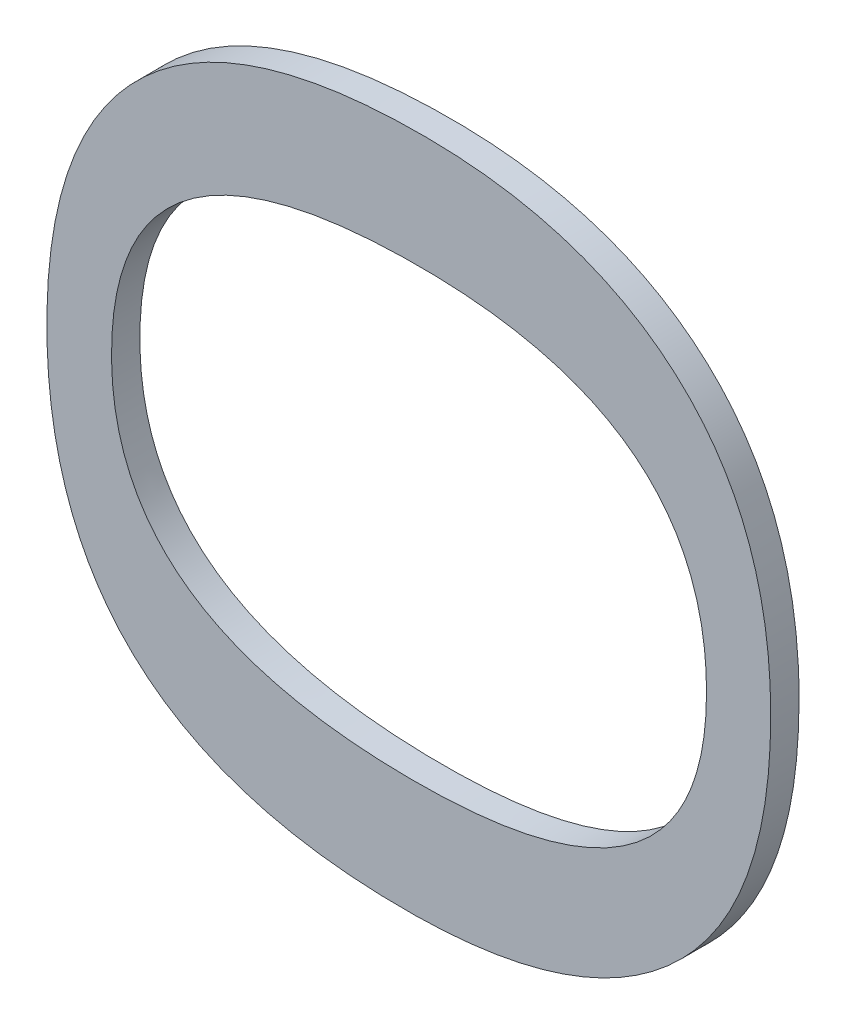
ISO-10303-21;
HEADER;
FILE_DESCRIPTION(('STEP AP214'),'2;1');
FILE_NAME('part.step','',(''),(''),'','','');
FILE_SCHEMA(('AUTOMOTIVE_DESIGN { 1 0 10303 214 1 1 1 1 }'));
ENDSEC;
DATA;
#1=APPLICATION_CONTEXT('core data for automotive mechanical design processes');
#2=APPLICATION_PROTOCOL_DEFINITION('international standard','automotive_design',2000,#1);
#3=PRODUCT_CONTEXT('',#1,'mechanical');
#4=PRODUCT('Part','Part','',(#3));
#5=PRODUCT_RELATED_PRODUCT_CATEGORY('part','',(#4));
#6=PRODUCT_DEFINITION_FORMATION('','',#4);
#7=PRODUCT_DEFINITION_CONTEXT('part definition',#1,'design');
#8=PRODUCT_DEFINITION('design','',#6,#7);
#9=PRODUCT_DEFINITION_SHAPE('','',#8);
#10=(LENGTH_UNIT() NAMED_UNIT(*) SI_UNIT(.MILLI.,.METRE.));
#11=(NAMED_UNIT(*) PLANE_ANGLE_UNIT() SI_UNIT($,.RADIAN.));
#12=(NAMED_UNIT(*) SI_UNIT($,.STERADIAN.) SOLID_ANGLE_UNIT());
#13=UNCERTAINTY_MEASURE_WITH_UNIT(LENGTH_MEASURE(1.E-05),#10,'distance_accuracy_value','');
#14=(GEOMETRIC_REPRESENTATION_CONTEXT(3) GLOBAL_UNCERTAINTY_ASSIGNED_CONTEXT((#13)) GLOBAL_UNIT_ASSIGNED_CONTEXT((#10,
#11,#12)) REPRESENTATION_CONTEXT('',''));
#15=CARTESIAN_POINT('',(0.,0.,0.));
#16=DIRECTION('',(0.,0.,1.));
#17=DIRECTION('',(1.,0.,0.));
#18=AXIS2_PLACEMENT_3D('',#15,#16,#17);
#19=CARTESIAN_POINT('',(-8.95983005625009,-22.770458436575,135.210489149433));
#20=DIRECTION('',(0.,0.,-1.));
#21=DIRECTION('',(0.,-1.,0.));
#22=AXIS2_PLACEMENT_3D('',#19,#20,#21);
#23=PLANE('',#22);
#24=CARTESIAN_POINT('',(-6.29001147151449,-72.1190216970193,135.210489149433));
#25=CARTESIAN_POINT('',(-6.29001147151449,-70.9888381640706,135.210489149433));
#26=CARTESIAN_POINT('',(-6.61246499090257,-70.1268343302034,135.210489149433));
#27=CARTESIAN_POINT('',(-7.90227810007331,-68.9391840910889,135.210489149433));
#28=CARTESIAN_POINT('',(-8.80738289127439,-68.6422713439259,135.210489149433));
#29=CARTESIAN_POINT('',(-11.2816541006977,-68.6422713439259,135.210489149433));
#30=CARTESIAN_POINT('',(-12.2729592930258,-68.9619308636323,135.210489149433));
#31=CARTESIAN_POINT('',(-13.6202393380541,-70.2405708105726,135.210489149433));
#32=CARTESIAN_POINT('',(-13.9570599991587,-71.1636336486134,135.210489149433));
#33=CARTESIAN_POINT('',(-13.9570599991587,-74.6834841594308,135.210489149433));
#34=CARTESIAN_POINT('',(-12.6895943050247,-75.8400064701279,135.210489149433));
#35=CARTESIAN_POINT('',(-8.92231678550516,-75.8400064701279,135.210489149433));
#36=CARTESIAN_POINT('',(-7.97012099303567,-75.5227409554942,135.210489149433));
#37=CARTESIAN_POINT('',(-6.62603373115335,-74.2536790970633,135.210489149433));
#38=CARTESIAN_POINT('',(-6.29001147151449,-73.3306162590225,135.210489149433));
#39=CARTESIAN_POINT('',(-6.29001147151449,-72.1190216970193,135.210489149433));
#40=(BOUNDED_CURVE() B_SPLINE_CURVE(3,(#24,#25,#26,#27,#28,#29,#30,#31,#32,#33,#34,#35,#36,#37,
#38,#39),.UNSPECIFIED.,.T.,.F.) B_SPLINE_CURVE_WITH_KNOTS((4,2,2,2,2,2,2,4),(0.,
0.11774611816292,0.235492162392912,0.367754812889115,0.500017386090146,0.753520659801151,
0.876760304214654,1.),
.UNSPECIFIED.) CURVE() GEOMETRIC_REPRESENTATION_ITEM() RATIONAL_B_SPLINE_CURVE((1.,1.,1.,1.,1.,
1.,1.,1.,1.,1.,1.,1.,1.,1.,1.,1.)) REPRESENTATION_ITEM(''));
#41=CARTESIAN_POINT('',(-6.29001147151449,-72.1190216970193,135.210489149433));
#42=VERTEX_POINT('',#41);
#43=EDGE_CURVE('E11',#42,#42,#40,.T.);
#44=ORIENTED_EDGE('',*,*,#43,.T.);
#45=EDGE_LOOP('',(#44));
#46=FACE_BOUND('',#45,.T.);
#47=CARTESIAN_POINT('',(-6.97003701237988,-72.2483223022706,135.210489149433));
#48=CARTESIAN_POINT('',(-6.97003701237988,-73.823874034696,135.210489149433));
#49=CARTESIAN_POINT('',(-7.99965314819718,-74.6116504755365,135.210489149433));
#50=CARTESIAN_POINT('',(-12.2011252545439,-74.6116504755365,135.210489149433));
#51=CARTESIAN_POINT('',(-13.2722455460337,-73.8430300578683,135.210489149433));
#52=CARTESIAN_POINT('',(-13.2722455460337,-70.677558960729,135.210489149433));
#53=CARTESIAN_POINT('',(-12.1867585177651,-69.8634439701279,135.210489149433));
#54=CARTESIAN_POINT('',(-7.98528641141834,-69.8634439701279,135.210489149433));
#55=CARTESIAN_POINT('',(-6.97003701237988,-70.6584032181571,135.210489149433));
#56=CARTESIAN_POINT('',(-6.97003701237988,-72.2483223022706,135.210489149433));
#57=(BOUNDED_CURVE() B_SPLINE_CURVE(3,(#47,#48,#49,#50,#51,#52,#53,#54,#55,#56),.UNSPECIFIED.,
.T.,.F.) B_SPLINE_CURVE_WITH_KNOTS((4,2,2,2,4),(0.,0.239648179665176,0.488956555898307,
0.753021542747821,1.),
.UNSPECIFIED.) CURVE() GEOMETRIC_REPRESENTATION_ITEM() RATIONAL_B_SPLINE_CURVE((1.,1.,1.,1.,1.,
1.,1.,1.,1.,1.)) REPRESENTATION_ITEM(''));
#58=CARTESIAN_POINT('',(-6.97003701237988,-72.2483223022706,135.210489149433));
#59=VERTEX_POINT('',#58);
#60=EDGE_CURVE('E67',#59,#59,#57,.T.);
#61=ORIENTED_EDGE('',*,*,#60,.T.);
#62=EDGE_LOOP('',(#61));
#63=FACE_BOUND('',#62,.T.);
#64=ADVANCED_FACE('F43',(#46,#63),#23,.F.);
#65=CARTESIAN_POINT('',(-6.29001147151449,-72.1190216970193,135.410489149433));
#66=CARTESIAN_POINT('',(-6.29001147151449,-70.9888381640706,135.410489149433));
#67=CARTESIAN_POINT('',(-6.61246499090257,-70.1268343302034,135.410489149433));
#68=CARTESIAN_POINT('',(-7.90227810007331,-68.9391840910889,135.410489149433));
#69=CARTESIAN_POINT('',(-8.80738289127439,-68.6422713439259,135.410489149433));
#70=CARTESIAN_POINT('',(-11.2816541006977,-68.6422713439259,135.410489149433));
#71=CARTESIAN_POINT('',(-12.2729592930258,-68.9619308636323,135.410489149433));
#72=CARTESIAN_POINT('',(-13.6202393380541,-70.2405708105726,135.410489149433));
#73=CARTESIAN_POINT('',(-13.9570599991587,-71.1636336486134,135.410489149433));
#74=CARTESIAN_POINT('',(-13.9570599991587,-74.6834841594308,135.410489149433));
#75=CARTESIAN_POINT('',(-12.6895943050247,-75.8400064701279,135.410489149433));
#76=CARTESIAN_POINT('',(-8.92231678550516,-75.8400064701279,135.410489149433));
#77=CARTESIAN_POINT('',(-7.97012099303567,-75.5227409554942,135.410489149433));
#78=CARTESIAN_POINT('',(-6.62603373115335,-74.2536790970633,135.410489149433));
#79=CARTESIAN_POINT('',(-6.29001147151449,-73.3306162590225,135.410489149433));
#80=CARTESIAN_POINT('',(-6.29001147151449,-72.1190216970193,135.410489149433));
#81=(BOUNDED_CURVE() B_SPLINE_CURVE(3,(#65,#66,#67,#68,#69,#70,#71,#72,#73,#74,#75,#76,#77,#78,
#79,#80),.UNSPECIFIED.,.T.,.F.) B_SPLINE_CURVE_WITH_KNOTS((4,2,2,2,2,2,2,4),(0.,
0.11774611816292,0.235492162392912,0.367754812889115,0.500017386090146,0.753520659801151,
0.876760304214654,1.),
.UNSPECIFIED.) CURVE() GEOMETRIC_REPRESENTATION_ITEM() RATIONAL_B_SPLINE_CURVE((1.,1.,1.,1.,1.,
1.,1.,1.,1.,1.,1.,1.,1.,1.,1.,1.)) REPRESENTATION_ITEM(''));
#82=DIRECTION('',(0.,0.,-1.));
#83=VECTOR('',#82,1.);
#84=SURFACE_OF_LINEAR_EXTRUSION('',#81,#83);
#85=ORIENTED_EDGE('',*,*,#43,.F.);
#86=EDGE_LOOP('',(#85));
#87=FACE_BOUND('',#86,.T.);
#88=CARTESIAN_POINT('',(-6.29001147151449,-72.1190216970193,134.910489149433));
#89=CARTESIAN_POINT('',(-6.29001147151449,-73.3306162590225,134.910489149433));
#90=CARTESIAN_POINT('',(-6.62603373115335,-74.2536790970633,134.910489149433));
#91=CARTESIAN_POINT('',(-7.97012099303567,-75.5227409554942,134.910489149433));
#92=CARTESIAN_POINT('',(-8.92231678550516,-75.8400064701279,134.910489149433));
#93=CARTESIAN_POINT('',(-12.6895943050247,-75.8400064701279,134.910489149433));
#94=CARTESIAN_POINT('',(-13.9570599991587,-74.6834841594308,134.910489149433));
#95=CARTESIAN_POINT('',(-13.9570599991587,-71.1636336486134,134.910489149433));
#96=CARTESIAN_POINT('',(-13.6202393380541,-70.2405708105726,134.910489149433));
#97=CARTESIAN_POINT('',(-12.2729592930258,-68.9619308636323,134.910489149433));
#98=CARTESIAN_POINT('',(-11.2816541006977,-68.6422713439259,134.910489149433));
#99=CARTESIAN_POINT('',(-8.80738289127439,-68.6422713439259,134.910489149433));
#100=CARTESIAN_POINT('',(-7.90227810007331,-68.9391840910889,134.910489149433));
#101=CARTESIAN_POINT('',(-6.61246499090257,-70.1268343302034,134.910489149433));
#102=CARTESIAN_POINT('',(-6.29001147151449,-70.9888381640706,134.910489149433));
#103=CARTESIAN_POINT('',(-6.29001147151449,-72.1190216970193,134.910489149433));
#104=(BOUNDED_CURVE() B_SPLINE_CURVE(3,(#88,#89,#90,#91,#92,#93,#94,#95,#96,#97,#98,#99,#100,
#101,#102,#103),.UNSPECIFIED.,.T.,.F.) B_SPLINE_CURVE_WITH_KNOTS((4,2,2,2,2,2,2,4),(0.,
0.123239695785346,0.246479340198849,0.499982613909854,0.632245187110885,0.764507837607088,
0.88225388183708,1.),
.UNSPECIFIED.) CURVE() GEOMETRIC_REPRESENTATION_ITEM() RATIONAL_B_SPLINE_CURVE((1.,1.,1.,1.,1.,
1.,1.,1.,1.,1.,1.,1.,1.,1.,1.,1.)) REPRESENTATION_ITEM(''));
#105=CARTESIAN_POINT('',(-6.29001147151449,-72.1190216970193,134.910489149433));
#106=VERTEX_POINT('',#105);
#107=EDGE_CURVE('E55',#106,#106,#104,.T.);
#108=ORIENTED_EDGE('',*,*,#107,.F.);
#109=EDGE_LOOP('',(#108));
#110=FACE_BOUND('',#109,.T.);
#111=ADVANCED_FACE('F45',(#87,#110),#84,.F.);
#112=CARTESIAN_POINT('',(-13.9570599816985,-72.3699636177594,134.910489149433));
#113=DIRECTION('',(0.,0.,1.));
#114=DIRECTION('',(1.,0.,0.));
#115=AXIS2_PLACEMENT_3D('',#112,#113,#114);
#116=PLANE('',#115);
#117=ORIENTED_EDGE('',*,*,#107,.T.);
#118=EDGE_LOOP('',(#117));
#119=FACE_BOUND('',#118,.T.);
#120=CARTESIAN_POINT('',(-6.97003701237988,-72.2483223022706,134.910489149433));
#121=CARTESIAN_POINT('',(-6.97003701237988,-70.6584032181571,134.910489149433));
#122=CARTESIAN_POINT('',(-7.98528641141834,-69.8634439701279,134.910489149433));
#123=CARTESIAN_POINT('',(-12.1867585177651,-69.8634439701279,134.910489149433));
#124=CARTESIAN_POINT('',(-13.2722455460337,-70.677558960729,134.910489149433));
#125=CARTESIAN_POINT('',(-13.2722455460337,-73.8430300578683,134.910489149433));
#126=CARTESIAN_POINT('',(-12.2011252545439,-74.6116504755365,134.910489149433));
#127=CARTESIAN_POINT('',(-7.99965314819718,-74.6116504755365,134.910489149433));
#128=CARTESIAN_POINT('',(-6.97003701237988,-73.823874034696,134.910489149433));
#129=CARTESIAN_POINT('',(-6.97003701237988,-72.2483223022706,134.910489149433));
#130=(BOUNDED_CURVE() B_SPLINE_CURVE(3,(#120,#121,#122,#123,#124,#125,#126,#127,#128,#129),
.UNSPECIFIED.,.T.,.F.) B_SPLINE_CURVE_WITH_KNOTS((4,2,2,2,4),(0.,0.246978457252179,
0.511043444101693,0.760351820334824,1.),
.UNSPECIFIED.) CURVE() GEOMETRIC_REPRESENTATION_ITEM() RATIONAL_B_SPLINE_CURVE((1.,1.,1.,1.,1.,
1.,1.,1.,1.,1.)) REPRESENTATION_ITEM(''));
#131=CARTESIAN_POINT('',(-6.97003701237988,-72.2483223022706,134.910489149433));
#132=VERTEX_POINT('',#131);
#133=EDGE_CURVE('E69',#132,#132,#130,.T.);
#134=ORIENTED_EDGE('',*,*,#133,.T.);
#135=EDGE_LOOP('',(#134));
#136=FACE_BOUND('',#135,.T.);
#137=ADVANCED_FACE('F103',(#119,#136),#116,.F.);
#138=CARTESIAN_POINT('',(-6.97003701237988,-72.2483223022706,135.410489149433));
#139=CARTESIAN_POINT('',(-6.97003701237988,-73.823874034696,135.410489149433));
#140=CARTESIAN_POINT('',(-7.99965314819718,-74.6116504755365,135.410489149433));
#141=CARTESIAN_POINT('',(-12.2011252545439,-74.6116504755365,135.410489149433));
#142=CARTESIAN_POINT('',(-13.2722455460337,-73.8430300578683,135.410489149433));
#143=CARTESIAN_POINT('',(-13.2722455460337,-70.677558960729,135.410489149433));
#144=CARTESIAN_POINT('',(-12.1867585177651,-69.8634439701279,135.410489149433));
#145=CARTESIAN_POINT('',(-7.98528641141834,-69.8634439701279,135.410489149433));
#146=CARTESIAN_POINT('',(-6.97003701237988,-70.6584032181571,135.410489149433));
#147=CARTESIAN_POINT('',(-6.97003701237988,-72.2483223022706,135.410489149433));
#148=(BOUNDED_CURVE() B_SPLINE_CURVE(3,(#138,#139,#140,#141,#142,#143,#144,#145,#146,#147),
.UNSPECIFIED.,.T.,.F.) B_SPLINE_CURVE_WITH_KNOTS((4,2,2,2,4),(0.,0.239648179665176,
0.488956555898307,0.753021542747821,1.),
.UNSPECIFIED.) CURVE() GEOMETRIC_REPRESENTATION_ITEM() RATIONAL_B_SPLINE_CURVE((1.,1.,1.,1.,1.,
1.,1.,1.,1.,1.)) REPRESENTATION_ITEM(''));
#149=DIRECTION('',(0.,0.,-1.));
#150=VECTOR('',#149,1.);
#151=SURFACE_OF_LINEAR_EXTRUSION('',#148,#150);
#152=ORIENTED_EDGE('',*,*,#60,.F.);
#153=EDGE_LOOP('',(#152));
#154=FACE_BOUND('',#153,.T.);
#155=ORIENTED_EDGE('',*,*,#133,.F.);
#156=EDGE_LOOP('',(#155));
#157=FACE_BOUND('',#156,.T.);
#158=ADVANCED_FACE('F100',(#154,#157),#151,.F.);
#159=CLOSED_SHELL('',(#64,#111,#137,#158));
#160=MANIFOLD_SOLID_BREP('B2',#159);
#161=ADVANCED_BREP_SHAPE_REPRESENTATION('',(#18,#160),#14);
#162=SHAPE_DEFINITION_REPRESENTATION(#9,#161);
ENDSEC;
END-ISO-10303-21;
